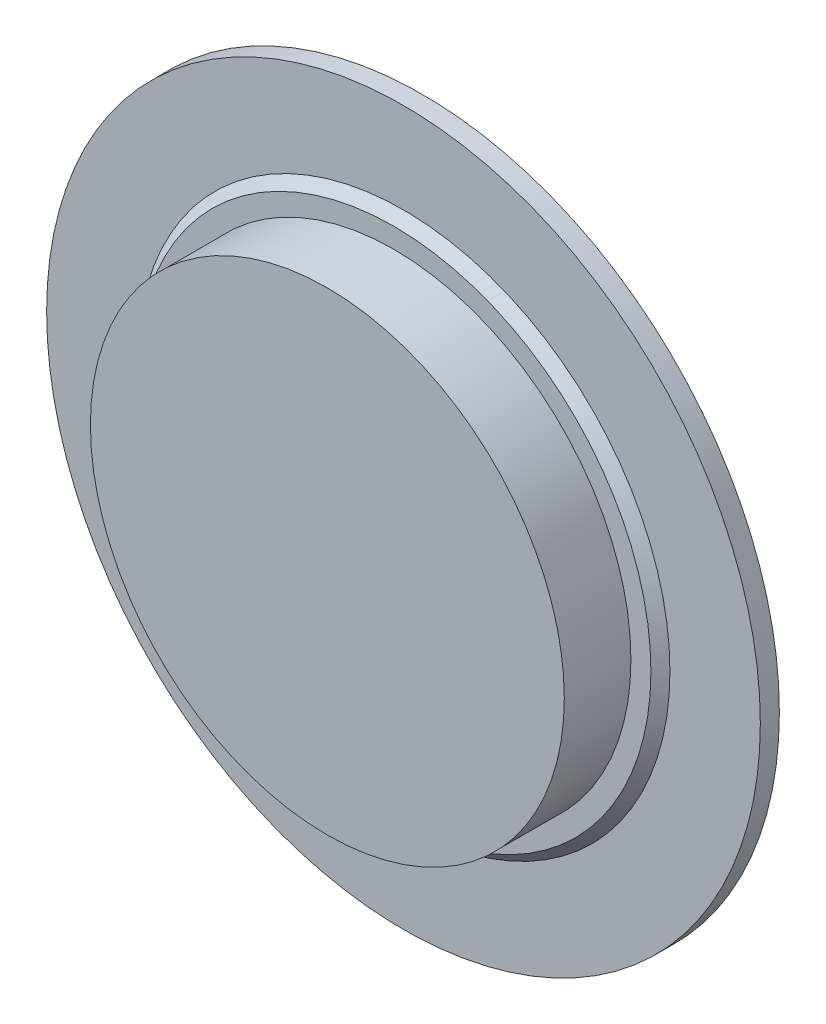
ISO-10303-21;
HEADER;
FILE_DESCRIPTION(('STEP AP214'),'2;1');
FILE_NAME('part.step','',(''),(''),'','','');
FILE_SCHEMA(('AUTOMOTIVE_DESIGN { 1 0 10303 214 1 1 1 1 }'));
ENDSEC;
DATA;
#1=APPLICATION_CONTEXT('core data for automotive mechanical design processes');
#2=APPLICATION_PROTOCOL_DEFINITION('international standard','automotive_design',2000,#1);
#3=PRODUCT_CONTEXT('',#1,'mechanical');
#4=PRODUCT('Part','Part','',(#3));
#5=PRODUCT_RELATED_PRODUCT_CATEGORY('part','',(#4));
#6=PRODUCT_DEFINITION_FORMATION('','',#4);
#7=PRODUCT_DEFINITION_CONTEXT('part definition',#1,'design');
#8=PRODUCT_DEFINITION('design','',#6,#7);
#9=PRODUCT_DEFINITION_SHAPE('','',#8);
#10=(LENGTH_UNIT() NAMED_UNIT(*) SI_UNIT(.MILLI.,.METRE.));
#11=(NAMED_UNIT(*) PLANE_ANGLE_UNIT() SI_UNIT($,.RADIAN.));
#12=(NAMED_UNIT(*) SI_UNIT($,.STERADIAN.) SOLID_ANGLE_UNIT());
#13=UNCERTAINTY_MEASURE_WITH_UNIT(LENGTH_MEASURE(1.E-05),#10,'distance_accuracy_value','');
#14=(GEOMETRIC_REPRESENTATION_CONTEXT(3) GLOBAL_UNCERTAINTY_ASSIGNED_CONTEXT((#13)) GLOBAL_UNIT_ASSIGNED_CONTEXT((#10,
#11,#12)) REPRESENTATION_CONTEXT('',''));
#15=CARTESIAN_POINT('',(0.,0.,0.));
#16=DIRECTION('',(0.,0.,1.));
#17=DIRECTION('',(1.,0.,0.));
#18=AXIS2_PLACEMENT_3D('',#15,#16,#17);
#19=CARTESIAN_POINT('',(0.,0.,2.));
#20=DIRECTION('',(0.,0.,-1.));
#21=DIRECTION('',(-1.,0.,0.));
#22=AXIS2_PLACEMENT_3D('',#19,#20,#21);
#23=CYLINDRICAL_SURFACE('',#22,37.5);
#24=CARTESIAN_POINT('',(0.,0.,2.));
#25=DIRECTION('',(0.,0.,1.));
#26=DIRECTION('',(1.,0.,0.));
#27=AXIS2_PLACEMENT_3D('',#24,#25,#26);
#28=CIRCLE('',#27,37.5);
#29=CARTESIAN_POINT('',(37.5,0.,2.));
#30=VERTEX_POINT('',#29);
#31=EDGE_CURVE('E56',#30,#30,#28,.T.);
#32=ORIENTED_EDGE('',*,*,#31,.F.);
#33=EDGE_LOOP('',(#32));
#34=FACE_BOUND('',#33,.T.);
#35=CARTESIAN_POINT('',(0.,0.,0.));
#36=DIRECTION('',(0.,0.,1.));
#37=DIRECTION('',(1.,0.,0.));
#38=AXIS2_PLACEMENT_3D('',#35,#36,#37);
#39=CIRCLE('',#38,37.5);
#40=CARTESIAN_POINT('',(37.5,0.,0.));
#41=VERTEX_POINT('',#40);
#42=EDGE_CURVE('E62',#41,#41,#39,.T.);
#43=ORIENTED_EDGE('',*,*,#42,.T.);
#44=EDGE_LOOP('',(#43));
#45=FACE_BOUND('',#44,.T.);
#46=ADVANCED_FACE('F39',(#34,#45),#23,.T.);
#47=CARTESIAN_POINT('',(0.,0.,2.));
#48=DIRECTION('',(0.,0.,1.));
#49=DIRECTION('',(1.,0.,0.));
#50=AXIS2_PLACEMENT_3D('',#47,#48,#49);
#51=PLANE('',#50);
#52=CARTESIAN_POINT('',(0.,0.,2.));
#53=DIRECTION('',(0.,0.,1.));
#54=DIRECTION('',(1.,0.,0.));
#55=AXIS2_PLACEMENT_3D('',#52,#53,#54);
#56=CIRCLE('',#55,28.);
#57=CARTESIAN_POINT('',(28.,0.,2.));
#58=VERTEX_POINT('',#57);
#59=EDGE_CURVE('E51',#58,#58,#56,.T.);
#60=ORIENTED_EDGE('',*,*,#59,.F.);
#61=EDGE_LOOP('',(#60));
#62=FACE_BOUND('',#61,.T.);
#63=ORIENTED_EDGE('',*,*,#31,.T.);
#64=EDGE_LOOP('',(#63));
#65=FACE_BOUND('',#64,.T.);
#66=ADVANCED_FACE('F83',(#62,#65),#51,.T.);
#67=CARTESIAN_POINT('',(0.,0.,0.));
#68=DIRECTION('',(0.,0.,1.));
#69=DIRECTION('',(1.,0.,0.));
#70=AXIS2_PLACEMENT_3D('',#67,#68,#69);
#71=PLANE('',#70);
#72=ORIENTED_EDGE('',*,*,#42,.F.);
#73=EDGE_LOOP('',(#72));
#74=FACE_BOUND('',#73,.T.);
#75=ADVANCED_FACE('F80',(#74),#71,.F.);
#76=CARTESIAN_POINT('',(0.,0.,3.));
#77=DIRECTION('',(0.,0.,1.));
#78=DIRECTION('',(1.,0.,0.));
#79=AXIS2_PLACEMENT_3D('',#76,#77,#78);
#80=PLANE('',#79);
#81=CARTESIAN_POINT('',(0.,0.,3.));
#82=DIRECTION('',(0.,0.,1.));
#83=DIRECTION('',(1.,0.,0.));
#84=AXIS2_PLACEMENT_3D('',#81,#82,#83);
#85=CIRCLE('',#84,27.);
#86=CARTESIAN_POINT('',(27.,0.,3.));
#87=VERTEX_POINT('',#86);
#88=EDGE_CURVE('E10',#87,#87,#85,.T.);
#89=ORIENTED_EDGE('',*,*,#88,.T.);
#90=EDGE_LOOP('',(#89));
#91=FACE_BOUND('',#90,.T.);
#92=CARTESIAN_POINT('',(0.,0.,3.));
#93=DIRECTION('',(0.,0.,1.));
#94=DIRECTION('',(1.,0.,0.));
#95=AXIS2_PLACEMENT_3D('',#92,#93,#94);
#96=CIRCLE('',#95,24.9);
#97=CARTESIAN_POINT('',(24.9,0.,3.));
#98=VERTEX_POINT('',#97);
#99=EDGE_CURVE('E47',#98,#98,#96,.T.);
#100=ORIENTED_EDGE('',*,*,#99,.F.);
#101=EDGE_LOOP('',(#100));
#102=FACE_BOUND('',#101,.T.);
#103=ADVANCED_FACE('F73',(#91,#102),#80,.T.);
#104=CARTESIAN_POINT('',(0.,0.,10.));
#105=DIRECTION('',(0.,0.,-1.));
#106=DIRECTION('',(-1.,0.,0.));
#107=AXIS2_PLACEMENT_3D('',#104,#105,#106);
#108=CYLINDRICAL_SURFACE('',#107,24.9);
#109=CARTESIAN_POINT('',(0.,0.,10.));
#110=DIRECTION('',(0.,0.,1.));
#111=DIRECTION('',(1.,0.,0.));
#112=AXIS2_PLACEMENT_3D('',#109,#110,#111);
#113=CIRCLE('',#112,24.9);
#114=CARTESIAN_POINT('',(24.9,0.,10.));
#115=VERTEX_POINT('',#114);
#116=EDGE_CURVE('E59',#115,#115,#113,.T.);
#117=ORIENTED_EDGE('',*,*,#116,.F.);
#118=EDGE_LOOP('',(#117));
#119=FACE_BOUND('',#118,.T.);
#120=ORIENTED_EDGE('',*,*,#99,.T.);
#121=EDGE_LOOP('',(#120));
#122=FACE_BOUND('',#121,.T.);
#123=ADVANCED_FACE('F71',(#119,#122),#108,.T.);
#124=CARTESIAN_POINT('',(0.,0.,10.));
#125=DIRECTION('',(0.,0.,1.));
#126=DIRECTION('',(1.,0.,0.));
#127=AXIS2_PLACEMENT_3D('',#124,#125,#126);
#128=PLANE('',#127);
#129=ORIENTED_EDGE('',*,*,#116,.T.);
#130=EDGE_LOOP('',(#129));
#131=FACE_BOUND('',#130,.T.);
#132=ADVANCED_FACE('F69',(#131),#128,.T.);
#133=CARTESIAN_POINT('',(0.,0.,3.));
#134=DIRECTION('',(0.,0.,-1.));
#135=DIRECTION('',(-1.,0.,0.));
#136=AXIS2_PLACEMENT_3D('',#133,#134,#135);
#137=CONICAL_SURFACE('',#136,27.,0.785398163397448);
#138=ORIENTED_EDGE('',*,*,#59,.T.);
#139=EDGE_LOOP('',(#138));
#140=FACE_BOUND('',#139,.T.);
#141=ORIENTED_EDGE('',*,*,#88,.F.);
#142=EDGE_LOOP('',(#141));
#143=FACE_BOUND('',#142,.T.);
#144=ADVANCED_FACE('F42',(#140,#143),#137,.T.);
#145=CLOSED_SHELL('',(#46,#66,#75,#103,#123,#132,#144));
#146=MANIFOLD_SOLID_BREP('B2',#145);
#147=ADVANCED_BREP_SHAPE_REPRESENTATION('',(#18,#146),#14);
#148=SHAPE_DEFINITION_REPRESENTATION(#9,#147);
ENDSEC;
END-ISO-10303-21;
